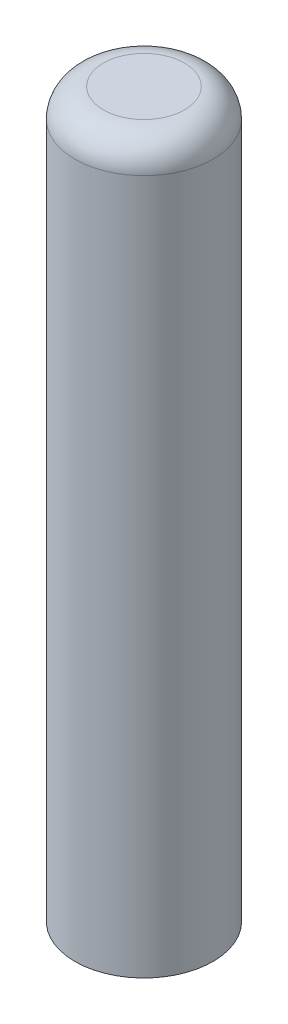
ISO-10303-21;
HEADER;
FILE_DESCRIPTION(('STEP AP214'),'2;1');
FILE_NAME('part.step','',(''),(''),'','','');
FILE_SCHEMA(('AUTOMOTIVE_DESIGN { 1 0 10303 214 1 1 1 1 }'));
ENDSEC;
DATA;
#1=APPLICATION_CONTEXT('core data for automotive mechanical design processes');
#2=APPLICATION_PROTOCOL_DEFINITION('international standard','automotive_design',2000,#1);
#3=PRODUCT_CONTEXT('',#1,'mechanical');
#4=PRODUCT('Part','Part','',(#3));
#5=PRODUCT_RELATED_PRODUCT_CATEGORY('part','',(#4));
#6=PRODUCT_DEFINITION_FORMATION('','',#4);
#7=PRODUCT_DEFINITION_CONTEXT('part definition',#1,'design');
#8=PRODUCT_DEFINITION('design','',#6,#7);
#9=PRODUCT_DEFINITION_SHAPE('','',#8);
#10=(LENGTH_UNIT() NAMED_UNIT(*) SI_UNIT(.MILLI.,.METRE.));
#11=(NAMED_UNIT(*) PLANE_ANGLE_UNIT() SI_UNIT($,.RADIAN.));
#12=(NAMED_UNIT(*) SI_UNIT($,.STERADIAN.) SOLID_ANGLE_UNIT());
#13=UNCERTAINTY_MEASURE_WITH_UNIT(LENGTH_MEASURE(1.E-05),#10,'distance_accuracy_value','');
#14=(GEOMETRIC_REPRESENTATION_CONTEXT(3) GLOBAL_UNCERTAINTY_ASSIGNED_CONTEXT((#13)) GLOBAL_UNIT_ASSIGNED_CONTEXT((#10,
#11,#12)) REPRESENTATION_CONTEXT('',''));
#15=CARTESIAN_POINT('',(0.,0.,0.));
#16=DIRECTION('',(0.,0.,1.));
#17=DIRECTION('',(1.,0.,0.));
#18=AXIS2_PLACEMENT_3D('',#15,#16,#17);
#19=CARTESIAN_POINT('',(0.,33.,0.));
#20=DIRECTION('',(0.,-1.,0.));
#21=DIRECTION('',(0.,0.,-1.));
#22=AXIS2_PLACEMENT_3D('',#19,#20,#21);
#23=CYLINDRICAL_SURFACE('',#22,3.15);
#24=CARTESIAN_POINT('',(0.,31.7,0.));
#25=DIRECTION('',(0.,1.,0.));
#26=DIRECTION('',(0.,0.,1.));
#27=AXIS2_PLACEMENT_3D('',#24,#25,#26);
#28=CIRCLE('',#27,3.15);
#29=CARTESIAN_POINT('',(0.,31.7,3.15));
#30=VERTEX_POINT('',#29);
#31=EDGE_CURVE('E10',#30,#30,#28,.F.);
#32=ORIENTED_EDGE('',*,*,#31,.T.);
#33=EDGE_LOOP('',(#32));
#34=FACE_BOUND('',#33,.T.);
#35=CARTESIAN_POINT('',(0.,0.,0.));
#36=DIRECTION('',(0.,1.,0.));
#37=DIRECTION('',(0.,0.,1.));
#38=AXIS2_PLACEMENT_3D('',#35,#36,#37);
#39=CIRCLE('',#38,3.15);
#40=CARTESIAN_POINT('',(0.,0.,3.15));
#41=VERTEX_POINT('',#40);
#42=EDGE_CURVE('E48',#41,#41,#39,.T.);
#43=ORIENTED_EDGE('',*,*,#42,.T.);
#44=EDGE_LOOP('',(#43));
#45=FACE_BOUND('',#44,.T.);
#46=ADVANCED_FACE('F37',(#34,#45),#23,.T.);
#47=CARTESIAN_POINT('',(0.,33.,0.));
#48=DIRECTION('',(0.,1.,0.));
#49=DIRECTION('',(0.,0.,1.));
#50=AXIS2_PLACEMENT_3D('',#47,#48,#49);
#51=PLANE('',#50);
#52=CARTESIAN_POINT('',(0.,33.,0.));
#53=DIRECTION('',(0.,1.,0.));
#54=DIRECTION('',(0.,0.,1.));
#55=AXIS2_PLACEMENT_3D('',#52,#53,#54);
#56=CIRCLE('',#55,1.85);
#57=CARTESIAN_POINT('',(0.,33.,1.85));
#58=VERTEX_POINT('',#57);
#59=EDGE_CURVE('E44',#58,#58,#56,.T.);
#60=ORIENTED_EDGE('',*,*,#59,.T.);
#61=EDGE_LOOP('',(#60));
#62=FACE_BOUND('',#61,.T.);
#63=ADVANCED_FACE('F72',(#62),#51,.T.);
#64=CARTESIAN_POINT('',(0.,0.,0.));
#65=DIRECTION('',(0.,1.,0.));
#66=DIRECTION('',(0.,0.,1.));
#67=AXIS2_PLACEMENT_3D('',#64,#65,#66);
#68=PLANE('',#67);
#69=CARTESIAN_POINT('',(0.,0.,0.));
#70=DIRECTION('',(0.,-1.,0.));
#71=DIRECTION('',(0.,0.,-1.));
#72=AXIS2_PLACEMENT_3D('',#69,#70,#71);
#73=CIRCLE('',#72,1.5);
#74=CARTESIAN_POINT('',(0.,0.,-1.5));
#75=VERTEX_POINT('',#74);
#76=EDGE_CURVE('E55',#75,#75,#73,.T.);
#77=ORIENTED_EDGE('',*,*,#76,.F.);
#78=EDGE_LOOP('',(#77));
#79=FACE_BOUND('',#78,.T.);
#80=ORIENTED_EDGE('',*,*,#42,.F.);
#81=EDGE_LOOP('',(#80));
#82=FACE_BOUND('',#81,.T.);
#83=ADVANCED_FACE('F69',(#79,#82),#68,.F.);
#84=CARTESIAN_POINT('',(0.,31.7,0.));
#85=DIRECTION('',(0.,1.,0.));
#86=DIRECTION('',(0.,0.,1.));
#87=AXIS2_PLACEMENT_3D('',#84,#85,#86);
#88=TOROIDAL_SURFACE('',#87,1.85,1.3);
#89=ORIENTED_EDGE('',*,*,#31,.F.);
#90=EDGE_LOOP('',(#89));
#91=FACE_BOUND('',#90,.T.);
#92=ORIENTED_EDGE('',*,*,#59,.F.);
#93=EDGE_LOOP('',(#92));
#94=FACE_BOUND('',#93,.T.);
#95=ADVANCED_FACE('F39',(#91,#94),#88,.T.);
#96=CARTESIAN_POINT('',(0.,12.,0.));
#97=DIRECTION('',(0.,-1.,0.));
#98=DIRECTION('',(0.,0.,-1.));
#99=AXIS2_PLACEMENT_3D('',#96,#97,#98);
#100=CYLINDRICAL_SURFACE('',#99,1.5);
#101=CARTESIAN_POINT('',(0.,12.,0.));
#102=DIRECTION('',(0.,-1.,0.));
#103=DIRECTION('',(0.,0.,-1.));
#104=AXIS2_PLACEMENT_3D('',#101,#102,#103);
#105=CIRCLE('',#104,1.5);
#106=CARTESIAN_POINT('',(0.,12.,-1.5));
#107=VERTEX_POINT('',#106);
#108=EDGE_CURVE('E52',#107,#107,#105,.T.);
#109=ORIENTED_EDGE('',*,*,#108,.F.);
#110=EDGE_LOOP('',(#109));
#111=FACE_BOUND('',#110,.T.);
#112=ORIENTED_EDGE('',*,*,#76,.T.);
#113=EDGE_LOOP('',(#112));
#114=FACE_BOUND('',#113,.T.);
#115=ADVANCED_FACE('F63',(#111,#114),#100,.F.);
#116=CARTESIAN_POINT('',(0.,12.,0.));
#117=DIRECTION('',(0.,-1.,0.));
#118=DIRECTION('',(0.,0.,-1.));
#119=AXIS2_PLACEMENT_3D('',#116,#117,#118);
#120=PLANE('',#119);
#121=ORIENTED_EDGE('',*,*,#108,.T.);
#122=EDGE_LOOP('',(#121));
#123=FACE_BOUND('',#122,.T.);
#124=ADVANCED_FACE('F61',(#123),#120,.T.);
#125=CLOSED_SHELL('',(#46,#63,#83,#95,#115,#124));
#126=MANIFOLD_SOLID_BREP('B2',#125);
#127=ADVANCED_BREP_SHAPE_REPRESENTATION('',(#18,#126),#14);
#128=SHAPE_DEFINITION_REPRESENTATION(#9,#127);
ENDSEC;
END-ISO-10303-21;
